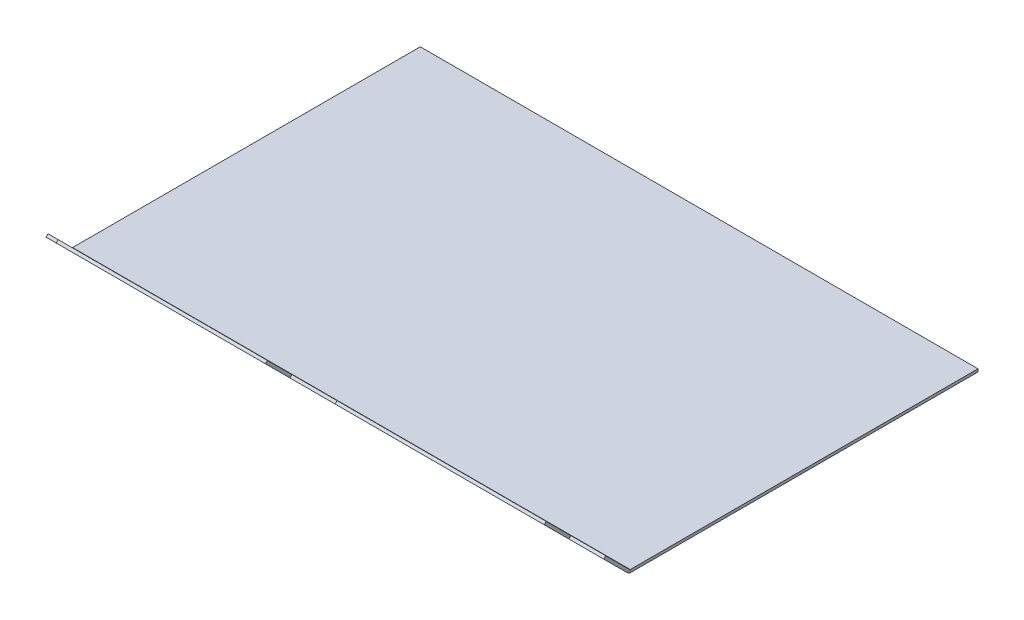
ISO-10303-21;
HEADER;
FILE_DESCRIPTION(('STEP AP214'),'2;1');
FILE_NAME('part.step','',(''),(''),'','','');
FILE_SCHEMA(('AUTOMOTIVE_DESIGN { 1 0 10303 214 1 1 1 1 }'));
ENDSEC;
DATA;
#1=APPLICATION_CONTEXT('core data for automotive mechanical design processes');
#2=APPLICATION_PROTOCOL_DEFINITION('international standard','automotive_design',2000,#1);
#3=PRODUCT_CONTEXT('',#1,'mechanical');
#4=PRODUCT('Part','Part','',(#3));
#5=PRODUCT_RELATED_PRODUCT_CATEGORY('part','',(#4));
#6=PRODUCT_DEFINITION_FORMATION('','',#4);
#7=PRODUCT_DEFINITION_CONTEXT('part definition',#1,'design');
#8=PRODUCT_DEFINITION('design','',#6,#7);
#9=PRODUCT_DEFINITION_SHAPE('','',#8);
#10=(LENGTH_UNIT() NAMED_UNIT(*) SI_UNIT(.MILLI.,.METRE.));
#11=(NAMED_UNIT(*) PLANE_ANGLE_UNIT() SI_UNIT($,.RADIAN.));
#12=(NAMED_UNIT(*) SI_UNIT($,.STERADIAN.) SOLID_ANGLE_UNIT());
#13=UNCERTAINTY_MEASURE_WITH_UNIT(LENGTH_MEASURE(1.E-05),#10,'distance_accuracy_value','');
#14=(GEOMETRIC_REPRESENTATION_CONTEXT(3) GLOBAL_UNCERTAINTY_ASSIGNED_CONTEXT((#13)) GLOBAL_UNIT_ASSIGNED_CONTEXT((#10,
#11,#12)) REPRESENTATION_CONTEXT('',''));
#15=CARTESIAN_POINT('',(0.,0.,0.));
#16=DIRECTION('',(0.,0.,1.));
#17=DIRECTION('',(1.,0.,0.));
#18=AXIS2_PLACEMENT_3D('',#15,#16,#17);
#19=CARTESIAN_POINT('',(-200.,33.674651235032,-13.8737731554559));
#20=DIRECTION('',(0.,0.707106781186549,0.707106781186546));
#21=DIRECTION('',(1.,0.,0.));
#22=AXIS2_PLACEMENT_3D('',#19,#20,#21);
#23=PLANE('',#22);
#24=DIRECTION('',(0.,0.707106781186546,-0.707106781186549));
#25=VECTOR('',#24,1.);
#26=CARTESIAN_POINT('',(-175.,33.674651235032,-13.873773155456));
#27=LINE('',#26,#25);
#28=CARTESIAN_POINT('',(-175.,33.674651235032,-13.873773155456));
#29=VERTEX_POINT('',#28);
#30=CARTESIAN_POINT('',(-175.,35.0888647974051,-15.287986717829));
#31=VERTEX_POINT('',#30);
#32=EDGE_CURVE('E163',#29,#31,#27,.T.);
#33=ORIENTED_EDGE('',*,*,#32,.F.);
#34=DIRECTION('',(1.,0.,0.));
#35=VECTOR('',#34,1.);
#36=CARTESIAN_POINT('',(-200.,33.674651235032,-13.8737731554559));
#37=LINE('',#36,#35);
#38=CARTESIAN_POINT('',(-25.,33.674651235032,-13.873773155456));
#39=VERTEX_POINT('',#38);
#40=EDGE_CURVE('E177',#29,#39,#37,.T.);
#41=ORIENTED_EDGE('',*,*,#40,.T.);
#42=DIRECTION('',(0.,0.707106781186546,-0.707106781186549));
#43=VECTOR('',#42,1.);
#44=CARTESIAN_POINT('',(-25.,33.674651235032,-13.873773155456));
#45=LINE('',#44,#43);
#46=CARTESIAN_POINT('',(-25.,35.0888647974051,-15.2879867178291));
#47=VERTEX_POINT('',#46);
#48=EDGE_CURVE('E257',#39,#47,#45,.T.);
#49=ORIENTED_EDGE('',*,*,#48,.T.);
#50=DIRECTION('',(1.,0.,0.));
#51=VECTOR('',#50,1.);
#52=CARTESIAN_POINT('',(-200.,35.0888647974051,-15.287986717829));
#53=LINE('',#52,#51);
#54=EDGE_CURVE('E179',#31,#47,#53,.T.);
#55=ORIENTED_EDGE('',*,*,#54,.F.);
#56=EDGE_LOOP('',(#33,#41,#49,#55));
#57=FACE_BOUND('',#56,.T.);
#58=ADVANCED_FACE('F43',(#57),#23,.T.);
#59=CARTESIAN_POINT('',(200.,33.674651235032,-13.8737731554559));
#60=DIRECTION('',(1.,0.,0.));
#61=DIRECTION('',(0.,-0.707106781186549,-0.707106781186546));
#62=AXIS2_PLACEMENT_3D('',#59,#60,#61);
#63=PLANE('',#62);
#64=DIRECTION('',(0.,0.707106781186546,-0.707106781186549));
#65=VECTOR('',#64,1.);
#66=CARTESIAN_POINT('',(200.,15.9969817053683,-31.5514426851196));
#67=LINE('',#66,#65);
#68=CARTESIAN_POINT('',(200.,15.9969817053683,-31.5514426851196));
#69=VERTEX_POINT('',#68);
#70=CARTESIAN_POINT('',(200.,17.4111952677414,-32.9656562474927));
#71=VERTEX_POINT('',#70);
#72=EDGE_CURVE('E60',#69,#71,#67,.T.);
#73=ORIENTED_EDGE('',*,*,#72,.F.);
#74=DIRECTION('',(0.,-0.707106781186549,-0.707106781186546));
#75=VECTOR('',#74,1.);
#76=CARTESIAN_POINT('',(200.,33.674651235032,-13.8737731554559));
#77=LINE('',#76,#75);
#78=CARTESIAN_POINT('',(200.,-1.19846841739511,-48.7468928078829));
#79=VERTEX_POINT('',#78);
#80=EDGE_CURVE('E206',#69,#79,#77,.T.);
#81=ORIENTED_EDGE('',*,*,#80,.T.);
#82=DIRECTION('',(0.,0.707106781186546,-0.707106781186549));
#83=VECTOR('',#82,1.);
#84=CARTESIAN_POINT('',(200.,-1.19846841739511,-48.7468928078829));
#85=LINE('',#84,#83);
#86=CARTESIAN_POINT('',(200.,0.21574514497799,-50.161106370256));
#87=VERTEX_POINT('',#86);
#88=EDGE_CURVE('E12',#79,#87,#85,.T.);
#89=ORIENTED_EDGE('',*,*,#88,.T.);
#90=DIRECTION('',(0.,-0.707106781186549,-0.707106781186546));
#91=VECTOR('',#90,1.);
#92=CARTESIAN_POINT('',(200.,35.0888647974051,-15.287986717829));
#93=LINE('',#92,#91);
#94=EDGE_CURVE('E208',#71,#87,#93,.T.);
#95=ORIENTED_EDGE('',*,*,#94,.F.);
#96=EDGE_LOOP('',(#73,#81,#89,#95));
#97=FACE_BOUND('',#96,.T.);
#98=ADVANCED_FACE('F45',(#97),#63,.T.);
#99=CARTESIAN_POINT('',(-200.,33.674651235032,-13.8737731554559));
#100=DIRECTION('',(-1.,0.,0.));
#101=DIRECTION('',(0.,0.707106781186549,0.707106781186546));
#102=AXIS2_PLACEMENT_3D('',#99,#100,#101);
#103=PLANE('',#102);
#104=DIRECTION('',(0.,0.707106781186546,-0.707106781186549));
#105=VECTOR('',#104,1.);
#106=CARTESIAN_POINT('',(-200.,15.9969817053683,-31.5514426851196));
#107=LINE('',#106,#105);
#108=CARTESIAN_POINT('',(-200.,15.9969817053683,-31.5514426851196));
#109=VERTEX_POINT('',#108);
#110=CARTESIAN_POINT('',(-200.,17.4111952677414,-32.9656562474927));
#111=VERTEX_POINT('',#110);
#112=EDGE_CURVE('E220',#109,#111,#107,.T.);
#113=ORIENTED_EDGE('',*,*,#112,.T.);
#114=DIRECTION('',(0.,0.707106781186549,0.707106781186546));
#115=VECTOR('',#114,1.);
#116=CARTESIAN_POINT('',(-200.,35.0888647974051,-15.287986717829));
#117=LINE('',#116,#115);
#118=CARTESIAN_POINT('',(-200.,0.21574514497799,-50.161106370256));
#119=VERTEX_POINT('',#118);
#120=EDGE_CURVE('E200',#119,#111,#117,.T.);
#121=ORIENTED_EDGE('',*,*,#120,.F.);
#122=DIRECTION('',(0.,-0.707106781186546,0.707106781186549));
#123=VECTOR('',#122,1.);
#124=CARTESIAN_POINT('',(-200.,-1.19846841739511,-48.7468928078829));
#125=LINE('',#124,#123);
#126=CARTESIAN_POINT('',(-200.,-1.1984684173951,-48.7468928078829));
#127=VERTEX_POINT('',#126);
#128=EDGE_CURVE('E191',#119,#127,#125,.T.);
#129=ORIENTED_EDGE('',*,*,#128,.T.);
#130=DIRECTION('',(0.,0.707106781186549,0.707106781186546));
#131=VECTOR('',#130,1.);
#132=CARTESIAN_POINT('',(-200.,33.674651235032,-13.8737731554559));
#133=LINE('',#132,#131);
#134=EDGE_CURVE('E47',#127,#109,#133,.T.);
#135=ORIENTED_EDGE('',*,*,#134,.T.);
#136=EDGE_LOOP('',(#113,#121,#129,#135));
#137=FACE_BOUND('',#136,.T.);
#138=ADVANCED_FACE('F218',(#137),#103,.T.);
#139=CARTESIAN_POINT('',(0.,33.674651235032,-13.8737731554559));
#140=DIRECTION('',(0.,-0.707106781186546,0.707106781186549));
#141=DIRECTION('',(0.,-0.707106781186549,-0.707106781186546));
#142=AXIS2_PLACEMENT_3D('',#139,#140,#141);
#143=PLANE('',#142);
#144=DIRECTION('',(0.,0.707106781186549,0.707106781186546));
#145=VECTOR('',#144,1.);
#146=CARTESIAN_POINT('',(175.,15.9969817053683,-31.5514426851196));
#147=LINE('',#146,#145);
#148=CARTESIAN_POINT('',(175.,15.9969817053683,-31.5514426851196));
#149=VERTEX_POINT('',#148);
#150=CARTESIAN_POINT('',(175.,33.6746512350319,-13.873773155456));
#151=VERTEX_POINT('',#150);
#152=EDGE_CURVE('E234',#149,#151,#147,.T.);
#153=ORIENTED_EDGE('',*,*,#152,.T.);
#154=CARTESIAN_POINT('',(25.,33.674651235032,-13.873773155456));
#155=VERTEX_POINT('',#154);
#156=EDGE_CURVE('E188',#155,#151,#37,.T.);
#157=ORIENTED_EDGE('',*,*,#156,.F.);
#158=DIRECTION('',(0.,-0.707106781186549,-0.707106781186546));
#159=VECTOR('',#158,1.);
#160=CARTESIAN_POINT('',(25.,33.674651235032,-13.873773155456));
#161=LINE('',#160,#159);
#162=CARTESIAN_POINT('',(25.,15.9969817053682,-31.5514426851196));
#163=VERTEX_POINT('',#162);
#164=EDGE_CURVE('E247',#155,#163,#161,.T.);
#165=ORIENTED_EDGE('',*,*,#164,.T.);
#166=DIRECTION('',(-1.,0.,0.));
#167=VECTOR('',#166,1.);
#168=CARTESIAN_POINT('',(-25.,15.9969817053682,-31.5514426851196));
#169=LINE('',#168,#167);
#170=CARTESIAN_POINT('',(-25.,15.9969817053682,-31.5514426851196));
#171=VERTEX_POINT('',#170);
#172=EDGE_CURVE('E250',#163,#171,#169,.T.);
#173=ORIENTED_EDGE('',*,*,#172,.T.);
#174=DIRECTION('',(0.,0.707106781186549,0.707106781186546));
#175=VECTOR('',#174,1.);
#176=CARTESIAN_POINT('',(-25.,33.674651235032,-13.873773155456));
#177=LINE('',#176,#175);
#178=EDGE_CURVE('E186',#171,#39,#177,.T.);
#179=ORIENTED_EDGE('',*,*,#178,.T.);
#180=ORIENTED_EDGE('',*,*,#40,.F.);
#181=DIRECTION('',(0.,-0.707106781186549,-0.707106781186546));
#182=VECTOR('',#181,1.);
#183=CARTESIAN_POINT('',(-175.,15.9969817053683,-31.5514426851196));
#184=LINE('',#183,#182);
#185=CARTESIAN_POINT('',(-175.,15.9969817053683,-31.5514426851196));
#186=VERTEX_POINT('',#185);
#187=EDGE_CURVE('E159',#29,#186,#184,.T.);
#188=ORIENTED_EDGE('',*,*,#187,.T.);
#189=DIRECTION('',(-1.,0.,0.));
#190=VECTOR('',#189,1.);
#191=CARTESIAN_POINT('',(-200.,15.9969817053683,-31.5514426851196));
#192=LINE('',#191,#190);
#193=EDGE_CURVE('E170',#186,#109,#192,.T.);
#194=ORIENTED_EDGE('',*,*,#193,.T.);
#195=ORIENTED_EDGE('',*,*,#134,.F.);
#196=DIRECTION('',(1.,0.,0.));
#197=VECTOR('',#196,1.);
#198=CARTESIAN_POINT('',(0.,-1.19846841739511,-48.7468928078829));
#199=LINE('',#198,#197);
#200=EDGE_CURVE('E187',#127,#79,#199,.T.);
#201=ORIENTED_EDGE('',*,*,#200,.T.);
#202=ORIENTED_EDGE('',*,*,#80,.F.);
#203=DIRECTION('',(-1.,0.,0.));
#204=VECTOR('',#203,1.);
#205=CARTESIAN_POINT('',(200.,15.9969817053683,-31.5514426851196));
#206=LINE('',#205,#204);
#207=EDGE_CURVE('E231',#69,#149,#206,.T.);
#208=ORIENTED_EDGE('',*,*,#207,.T.);
#209=EDGE_LOOP('',(#153,#157,#165,#173,#179,#180,#188,#194,#195,#201,#202,#208));
#210=FACE_BOUND('',#209,.T.);
#211=ADVANCED_FACE('F183',(#210),#143,.T.);
#212=DIRECTION('',(0.,0.707106781186546,-0.707106781186549));
#213=VECTOR('',#212,1.);
#214=CARTESIAN_POINT('',(175.,33.6746512350319,-13.873773155456));
#215=LINE('',#214,#213);
#216=CARTESIAN_POINT('',(175.,35.088864797405,-15.2879867178291));
#217=VERTEX_POINT('',#216);
#218=EDGE_CURVE('E240',#151,#217,#215,.T.);
#219=ORIENTED_EDGE('',*,*,#218,.T.);
#220=CARTESIAN_POINT('',(25.,35.0888647974051,-15.287986717829));
#221=VERTEX_POINT('',#220);
#222=EDGE_CURVE('E198',#221,#217,#53,.T.);
#223=ORIENTED_EDGE('',*,*,#222,.F.);
#224=DIRECTION('',(0.,0.707106781186546,-0.707106781186549));
#225=VECTOR('',#224,1.);
#226=CARTESIAN_POINT('',(25.,33.674651235032,-13.873773155456));
#227=LINE('',#226,#225);
#228=EDGE_CURVE('E68',#155,#221,#227,.T.);
#229=ORIENTED_EDGE('',*,*,#228,.F.);
#230=ORIENTED_EDGE('',*,*,#156,.T.);
#231=EDGE_LOOP('',(#219,#223,#229,#230));
#232=FACE_BOUND('',#231,.T.);
#233=ADVANCED_FACE('F347',(#232),#23,.T.);
#234=CARTESIAN_POINT('',(0.,35.0888647974051,-15.287986717829));
#235=DIRECTION('',(0.,-0.707106781186546,0.707106781186549));
#236=DIRECTION('',(0.,-0.707106781186549,-0.707106781186546));
#237=AXIS2_PLACEMENT_3D('',#234,#235,#236);
#238=PLANE('',#237);
#239=ORIENTED_EDGE('',*,*,#222,.T.);
#240=DIRECTION('',(0.,0.707106781186549,0.707106781186546));
#241=VECTOR('',#240,1.);
#242=CARTESIAN_POINT('',(175.,17.4111952677414,-32.9656562474927));
#243=LINE('',#242,#241);
#244=CARTESIAN_POINT('',(175.,17.4111952677414,-32.9656562474927));
#245=VERTEX_POINT('',#244);
#246=EDGE_CURVE('E235',#245,#217,#243,.T.);
#247=ORIENTED_EDGE('',*,*,#246,.F.);
#248=DIRECTION('',(-1.,0.,0.));
#249=VECTOR('',#248,1.);
#250=CARTESIAN_POINT('',(200.,17.4111952677414,-32.9656562474927));
#251=LINE('',#250,#249);
#252=EDGE_CURVE('E237',#71,#245,#251,.T.);
#253=ORIENTED_EDGE('',*,*,#252,.F.);
#254=ORIENTED_EDGE('',*,*,#94,.T.);
#255=DIRECTION('',(1.,0.,0.));
#256=VECTOR('',#255,1.);
#257=CARTESIAN_POINT('',(0.,0.215745144977984,-50.161106370256));
#258=LINE('',#257,#256);
#259=EDGE_CURVE('E52',#119,#87,#258,.T.);
#260=ORIENTED_EDGE('',*,*,#259,.F.);
#261=ORIENTED_EDGE('',*,*,#120,.T.);
#262=DIRECTION('',(-1.,0.,0.));
#263=VECTOR('',#262,1.);
#264=CARTESIAN_POINT('',(-200.,17.4111952677414,-32.9656562474927));
#265=LINE('',#264,#263);
#266=CARTESIAN_POINT('',(-175.,17.4111952677414,-32.9656562474927));
#267=VERTEX_POINT('',#266);
#268=EDGE_CURVE('E171',#267,#111,#265,.T.);
#269=ORIENTED_EDGE('',*,*,#268,.F.);
#270=DIRECTION('',(0.,-0.707106781186549,-0.707106781186546));
#271=VECTOR('',#270,1.);
#272=CARTESIAN_POINT('',(-175.,17.4111952677414,-32.9656562474927));
#273=LINE('',#272,#271);
#274=EDGE_CURVE('E243',#31,#267,#273,.T.);
#275=ORIENTED_EDGE('',*,*,#274,.F.);
#276=ORIENTED_EDGE('',*,*,#54,.T.);
#277=DIRECTION('',(0.,0.707106781186549,0.707106781186546));
#278=VECTOR('',#277,1.);
#279=CARTESIAN_POINT('',(-25.,35.0888647974051,-15.2879867178291));
#280=LINE('',#279,#278);
#281=CARTESIAN_POINT('',(-25.,17.4111952677413,-32.9656562474927));
#282=VERTEX_POINT('',#281);
#283=EDGE_CURVE('E251',#282,#47,#280,.T.);
#284=ORIENTED_EDGE('',*,*,#283,.F.);
#285=DIRECTION('',(-1.,0.,0.));
#286=VECTOR('',#285,1.);
#287=CARTESIAN_POINT('',(-25.,17.4111952677413,-32.9656562474927));
#288=LINE('',#287,#286);
#289=CARTESIAN_POINT('',(25.,17.4111952677413,-32.9656562474927));
#290=VERTEX_POINT('',#289);
#291=EDGE_CURVE('E225',#290,#282,#288,.T.);
#292=ORIENTED_EDGE('',*,*,#291,.F.);
#293=DIRECTION('',(0.,-0.707106781186549,-0.707106781186546));
#294=VECTOR('',#293,1.);
#295=CARTESIAN_POINT('',(25.,35.0888647974051,-15.2879867178291));
#296=LINE('',#295,#294);
#297=EDGE_CURVE('E223',#221,#290,#296,.T.);
#298=ORIENTED_EDGE('',*,*,#297,.F.);
#299=EDGE_LOOP('',(#239,#247,#253,#254,#260,#261,#269,#275,#276,#284,#292,#298));
#300=FACE_BOUND('',#299,.T.);
#301=ADVANCED_FACE('F215',(#300),#238,.F.);
#302=CARTESIAN_POINT('',(-200.,-2.,-300.));
#303=DIRECTION('',(0.,0.,-1.));
#304=DIRECTION('',(-1.,0.,0.));
#305=AXIS2_PLACEMENT_3D('',#302,#303,#304);
#306=PLANE('',#305);
#307=DIRECTION('',(-1.,0.,0.));
#308=VECTOR('',#307,1.);
#309=CARTESIAN_POINT('',(-200.,0.,-300.));
#310=LINE('',#309,#308);
#311=CARTESIAN_POINT('',(200.,0.,-300.));
#312=VERTEX_POINT('',#311);
#313=CARTESIAN_POINT('',(-200.,0.,-300.));
#314=VERTEX_POINT('',#313);
#315=EDGE_CURVE('E280',#312,#314,#310,.T.);
#316=ORIENTED_EDGE('',*,*,#315,.F.);
#317=DIRECTION('',(0.,1.,0.));
#318=VECTOR('',#317,1.);
#319=CARTESIAN_POINT('',(200.,-2.,-300.));
#320=LINE('',#319,#318);
#321=CARTESIAN_POINT('',(200.,-2.,-300.));
#322=VERTEX_POINT('',#321);
#323=EDGE_CURVE('E209',#322,#312,#320,.T.);
#324=ORIENTED_EDGE('',*,*,#323,.F.);
#325=DIRECTION('',(-1.,0.,0.));
#326=VECTOR('',#325,1.);
#327=CARTESIAN_POINT('',(-200.,-2.,-300.));
#328=LINE('',#327,#326);
#329=CARTESIAN_POINT('',(-200.,-2.,-300.));
#330=VERTEX_POINT('',#329);
#331=EDGE_CURVE('E294',#322,#330,#328,.T.);
#332=ORIENTED_EDGE('',*,*,#331,.T.);
#333=DIRECTION('',(0.,1.,0.));
#334=VECTOR('',#333,1.);
#335=CARTESIAN_POINT('',(-200.,-2.,-300.));
#336=LINE('',#335,#334);
#337=EDGE_CURVE('E292',#330,#314,#336,.T.);
#338=ORIENTED_EDGE('',*,*,#337,.T.);
#339=EDGE_LOOP('',(#316,#324,#332,#338));
#340=FACE_BOUND('',#339,.T.);
#341=ADVANCED_FACE('F332',(#340),#306,.T.);
#342=CARTESIAN_POINT('',(0.,-2.,0.));
#343=DIRECTION('',(0.,-1.,0.));
#344=DIRECTION('',(0.,0.,-1.));
#345=AXIS2_PLACEMENT_3D('',#342,#343,#344);
#346=PLANE('',#345);
#347=DIRECTION('',(1.,0.,0.));
#348=VECTOR('',#347,1.);
#349=CARTESIAN_POINT('',(0.,-2.,-50.681961225278));
#350=LINE('',#349,#348);
#351=CARTESIAN_POINT('',(-200.,-2.,-50.681961225278));
#352=VERTEX_POINT('',#351);
#353=CARTESIAN_POINT('',(200.,-2.,-50.681961225278));
#354=VERTEX_POINT('',#353);
#355=EDGE_CURVE('E196',#352,#354,#350,.T.);
#356=ORIENTED_EDGE('',*,*,#355,.F.);
#357=DIRECTION('',(0.,0.,1.));
#358=VECTOR('',#357,1.);
#359=CARTESIAN_POINT('',(-200.,-2.,0.));
#360=LINE('',#359,#358);
#361=EDGE_CURVE('E290',#330,#352,#360,.T.);
#362=ORIENTED_EDGE('',*,*,#361,.F.);
#363=ORIENTED_EDGE('',*,*,#331,.F.);
#364=DIRECTION('',(0.,0.,-1.));
#365=VECTOR('',#364,1.);
#366=CARTESIAN_POINT('',(200.,-2.,0.));
#367=LINE('',#366,#365);
#368=EDGE_CURVE('E278',#354,#322,#367,.T.);
#369=ORIENTED_EDGE('',*,*,#368,.F.);
#370=EDGE_LOOP('',(#356,#362,#363,#369));
#371=FACE_BOUND('',#370,.T.);
#372=ADVANCED_FACE('F334',(#371),#346,.T.);
#373=CARTESIAN_POINT('',(-200.,-2.,0.));
#374=DIRECTION('',(-1.,0.,0.));
#375=DIRECTION('',(0.,0.,1.));
#376=AXIS2_PLACEMENT_3D('',#373,#374,#375);
#377=PLANE('',#376);
#378=DIRECTION('',(0.,-1.,0.));
#379=VECTOR('',#378,1.);
#380=CARTESIAN_POINT('',(-200.,-2.,-50.681961225278));
#381=LINE('',#380,#379);
#382=CARTESIAN_POINT('',(-200.,0.,-50.681961225278));
#383=VERTEX_POINT('',#382);
#384=EDGE_CURVE('E297',#383,#352,#381,.T.);
#385=ORIENTED_EDGE('',*,*,#384,.F.);
#386=DIRECTION('',(0.,0.,1.));
#387=VECTOR('',#386,1.);
#388=CARTESIAN_POINT('',(-200.,0.,0.));
#389=LINE('',#388,#387);
#390=EDGE_CURVE('E288',#314,#383,#389,.T.);
#391=ORIENTED_EDGE('',*,*,#390,.F.);
#392=ORIENTED_EDGE('',*,*,#337,.F.);
#393=ORIENTED_EDGE('',*,*,#361,.T.);
#394=EDGE_LOOP('',(#385,#391,#392,#393));
#395=FACE_BOUND('',#394,.T.);
#396=ADVANCED_FACE('F324',(#395),#377,.T.);
#397=CARTESIAN_POINT('',(0.,0.,0.));
#398=DIRECTION('',(0.,-1.,0.));
#399=DIRECTION('',(0.,0.,-1.));
#400=AXIS2_PLACEMENT_3D('',#397,#398,#399);
#401=PLANE('',#400);
#402=ORIENTED_EDGE('',*,*,#390,.T.);
#403=DIRECTION('',(1.,0.,0.));
#404=VECTOR('',#403,1.);
#405=CARTESIAN_POINT('',(0.,0.,-50.681961225278));
#406=LINE('',#405,#404);
#407=CARTESIAN_POINT('',(200.,0.,-50.681961225278));
#408=VERTEX_POINT('',#407);
#409=EDGE_CURVE('E285',#383,#408,#406,.T.);
#410=ORIENTED_EDGE('',*,*,#409,.T.);
#411=DIRECTION('',(0.,0.,-1.));
#412=VECTOR('',#411,1.);
#413=CARTESIAN_POINT('',(200.,0.,0.));
#414=LINE('',#413,#412);
#415=EDGE_CURVE('E283',#408,#312,#414,.T.);
#416=ORIENTED_EDGE('',*,*,#415,.T.);
#417=ORIENTED_EDGE('',*,*,#315,.T.);
#418=EDGE_LOOP('',(#402,#410,#416,#417));
#419=FACE_BOUND('',#418,.T.);
#420=ADVANCED_FACE('F328',(#419),#401,.F.);
#421=CARTESIAN_POINT('',(200.,-2.,0.));
#422=DIRECTION('',(1.,0.,0.));
#423=DIRECTION('',(0.,0.,-1.));
#424=AXIS2_PLACEMENT_3D('',#421,#422,#423);
#425=PLANE('',#424);
#426=DIRECTION('',(0.,1.,0.));
#427=VECTOR('',#426,1.);
#428=CARTESIAN_POINT('',(200.,-2.,-50.681961225278));
#429=LINE('',#428,#427);
#430=EDGE_CURVE('E299',#354,#408,#429,.T.);
#431=ORIENTED_EDGE('',*,*,#430,.F.);
#432=ORIENTED_EDGE('',*,*,#368,.T.);
#433=ORIENTED_EDGE('',*,*,#323,.T.);
#434=ORIENTED_EDGE('',*,*,#415,.F.);
#435=EDGE_LOOP('',(#431,#432,#433,#434));
#436=FACE_BOUND('',#435,.T.);
#437=ADVANCED_FACE('F336',(#436),#425,.T.);
#438=CARTESIAN_POINT('',(-200.,0.7366,-50.681961225278));
#439=DIRECTION('',(-1.,0.,0.));
#440=DIRECTION('',(0.,0.,1.));
#441=AXIS2_PLACEMENT_3D('',#438,#439,#440);
#442=PLANE('',#441);
#443=ORIENTED_EDGE('',*,*,#128,.F.);
#444=CARTESIAN_POINT('',(-200.,0.7366,-50.681961225278));
#445=DIRECTION('',(-1.,0.,0.));
#446=DIRECTION('',(0.,0.,1.));
#447=AXIS2_PLACEMENT_3D('',#444,#445,#446);
#448=CIRCLE('',#447,0.7366);
#449=EDGE_CURVE('E259',#119,#383,#448,.F.);
#450=ORIENTED_EDGE('',*,*,#449,.T.);
#451=ORIENTED_EDGE('',*,*,#384,.T.);
#452=CARTESIAN_POINT('',(-200.,0.7366,-50.681961225278));
#453=DIRECTION('',(1.,0.,0.));
#454=DIRECTION('',(0.,0.,1.));
#455=AXIS2_PLACEMENT_3D('',#452,#453,#454);
#456=CIRCLE('',#455,2.7366);
#457=EDGE_CURVE('E265',#127,#352,#456,.T.);
#458=ORIENTED_EDGE('',*,*,#457,.F.);
#459=EDGE_LOOP('',(#443,#450,#451,#458));
#460=FACE_BOUND('',#459,.T.);
#461=ADVANCED_FACE('F318',(#460),#442,.T.);
#462=CARTESIAN_POINT('',(200.,0.7366,-50.681961225278));
#463=DIRECTION('',(1.,0.,0.));
#464=DIRECTION('',(0.,0.,-1.));
#465=AXIS2_PLACEMENT_3D('',#462,#463,#464);
#466=PLANE('',#465);
#467=CARTESIAN_POINT('',(200.,0.7366,-50.681961225278));
#468=DIRECTION('',(-1.,0.,0.));
#469=DIRECTION('',(0.,0.,1.));
#470=AXIS2_PLACEMENT_3D('',#467,#468,#469);
#471=CIRCLE('',#470,0.7366);
#472=EDGE_CURVE('E269',#408,#87,#471,.T.);
#473=ORIENTED_EDGE('',*,*,#472,.T.);
#474=ORIENTED_EDGE('',*,*,#88,.F.);
#475=CARTESIAN_POINT('',(200.,0.7366,-50.681961225278));
#476=DIRECTION('',(-1.,0.,0.));
#477=DIRECTION('',(0.,0.,-1.));
#478=AXIS2_PLACEMENT_3D('',#475,#476,#477);
#479=CIRCLE('',#478,2.7366);
#480=EDGE_CURVE('E268',#354,#79,#479,.T.);
#481=ORIENTED_EDGE('',*,*,#480,.F.);
#482=ORIENTED_EDGE('',*,*,#430,.T.);
#483=EDGE_LOOP('',(#473,#474,#481,#482));
#484=FACE_BOUND('',#483,.T.);
#485=ADVANCED_FACE('F313',(#484),#466,.T.);
#486=CARTESIAN_POINT('',(400.007325288489,0.7366,-50.681961225278));
#487=DIRECTION('',(-1.,0.,0.));
#488=DIRECTION('',(0.,0.,1.));
#489=AXIS2_PLACEMENT_3D('',#486,#487,#488);
#490=CYLINDRICAL_SURFACE('',#489,2.7366);
#491=ORIENTED_EDGE('',*,*,#355,.T.);
#492=ORIENTED_EDGE('',*,*,#480,.T.);
#493=ORIENTED_EDGE('',*,*,#200,.F.);
#494=ORIENTED_EDGE('',*,*,#457,.T.);
#495=EDGE_LOOP('',(#491,#492,#493,#494));
#496=FACE_BOUND('',#495,.T.);
#497=ADVANCED_FACE('F308',(#496),#490,.T.);
#498=CARTESIAN_POINT('',(400.007325288489,0.7366,-50.681961225278));
#499=DIRECTION('',(-1.,0.,0.));
#500=DIRECTION('',(0.,0.,1.));
#501=AXIS2_PLACEMENT_3D('',#498,#499,#500);
#502=CYLINDRICAL_SURFACE('',#501,0.7366);
#503=ORIENTED_EDGE('',*,*,#409,.F.);
#504=ORIENTED_EDGE('',*,*,#449,.F.);
#505=ORIENTED_EDGE('',*,*,#259,.T.);
#506=ORIENTED_EDGE('',*,*,#472,.F.);
#507=EDGE_LOOP('',(#503,#504,#505,#506));
#508=FACE_BOUND('',#507,.T.);
#509=ADVANCED_FACE('F326',(#508),#502,.F.);
#510=CARTESIAN_POINT('',(-25.,33.674651235032,-13.873773155456));
#511=DIRECTION('',(-1.,0.,0.));
#512=DIRECTION('',(0.,-1.,0.));
#513=AXIS2_PLACEMENT_3D('',#510,#511,#512);
#514=PLANE('',#513);
#515=ORIENTED_EDGE('',*,*,#283,.T.);
#516=ORIENTED_EDGE('',*,*,#48,.F.);
#517=ORIENTED_EDGE('',*,*,#178,.F.);
#518=DIRECTION('',(0.,0.707106781186546,-0.707106781186549));
#519=VECTOR('',#518,1.);
#520=CARTESIAN_POINT('',(-25.,15.9969817053682,-31.5514426851196));
#521=LINE('',#520,#519);
#522=EDGE_CURVE('E260',#171,#282,#521,.T.);
#523=ORIENTED_EDGE('',*,*,#522,.T.);
#524=EDGE_LOOP('',(#515,#516,#517,#523));
#525=FACE_BOUND('',#524,.T.);
#526=ADVANCED_FACE('F379',(#525),#514,.F.);
#527=CARTESIAN_POINT('',(-25.,15.9969817053682,-31.5514426851196));
#528=DIRECTION('',(0.,-0.707106781186549,-0.707106781186546));
#529=DIRECTION('',(0.,0.707106781186546,-0.707106781186549));
#530=AXIS2_PLACEMENT_3D('',#527,#528,#529);
#531=PLANE('',#530);
#532=ORIENTED_EDGE('',*,*,#291,.T.);
#533=ORIENTED_EDGE('',*,*,#522,.F.);
#534=ORIENTED_EDGE('',*,*,#172,.F.);
#535=DIRECTION('',(0.,0.707106781186546,-0.707106781186549));
#536=VECTOR('',#535,1.);
#537=CARTESIAN_POINT('',(25.,15.9969817053682,-31.5514426851196));
#538=LINE('',#537,#536);
#539=EDGE_CURVE('E262',#163,#290,#538,.T.);
#540=ORIENTED_EDGE('',*,*,#539,.T.);
#541=EDGE_LOOP('',(#532,#533,#534,#540));
#542=FACE_BOUND('',#541,.T.);
#543=ADVANCED_FACE('F368',(#542),#531,.F.);
#544=CARTESIAN_POINT('',(25.,33.674651235032,-13.873773155456));
#545=DIRECTION('',(1.,0.,0.));
#546=DIRECTION('',(0.,1.,0.));
#547=AXIS2_PLACEMENT_3D('',#544,#545,#546);
#548=PLANE('',#547);
#549=ORIENTED_EDGE('',*,*,#297,.T.);
#550=ORIENTED_EDGE('',*,*,#539,.F.);
#551=ORIENTED_EDGE('',*,*,#164,.F.);
#552=ORIENTED_EDGE('',*,*,#228,.T.);
#553=EDGE_LOOP('',(#549,#550,#551,#552));
#554=FACE_BOUND('',#553,.T.);
#555=ADVANCED_FACE('F365',(#554),#548,.F.);
#556=CARTESIAN_POINT('',(-200.,15.9969817053683,-31.5514426851196));
#557=DIRECTION('',(0.,-0.707106781186549,-0.707106781186546));
#558=DIRECTION('',(0.,0.707106781186546,-0.707106781186549));
#559=AXIS2_PLACEMENT_3D('',#556,#557,#558);
#560=PLANE('',#559);
#561=ORIENTED_EDGE('',*,*,#268,.T.);
#562=ORIENTED_EDGE('',*,*,#112,.F.);
#563=ORIENTED_EDGE('',*,*,#193,.F.);
#564=DIRECTION('',(0.,0.707106781186546,-0.707106781186549));
#565=VECTOR('',#564,1.);
#566=CARTESIAN_POINT('',(-175.,15.9969817053683,-31.5514426851196));
#567=LINE('',#566,#565);
#568=EDGE_CURVE('E165',#186,#267,#567,.T.);
#569=ORIENTED_EDGE('',*,*,#568,.T.);
#570=EDGE_LOOP('',(#561,#562,#563,#569));
#571=FACE_BOUND('',#570,.T.);
#572=ADVANCED_FACE('F387',(#571),#560,.F.);
#573=CARTESIAN_POINT('',(-175.,15.9969817053683,-31.5514426851196));
#574=DIRECTION('',(1.,0.,0.));
#575=DIRECTION('',(0.,0.,-1.));
#576=AXIS2_PLACEMENT_3D('',#573,#574,#575);
#577=PLANE('',#576);
#578=ORIENTED_EDGE('',*,*,#274,.T.);
#579=ORIENTED_EDGE('',*,*,#568,.F.);
#580=ORIENTED_EDGE('',*,*,#187,.F.);
#581=ORIENTED_EDGE('',*,*,#32,.T.);
#582=EDGE_LOOP('',(#578,#579,#580,#581));
#583=FACE_BOUND('',#582,.T.);
#584=ADVANCED_FACE('F162',(#583),#577,.F.);
#585=CARTESIAN_POINT('',(175.,15.9969817053683,-31.5514426851196));
#586=DIRECTION('',(-1.,0.,0.));
#587=DIRECTION('',(0.,0.,1.));
#588=AXIS2_PLACEMENT_3D('',#585,#586,#587);
#589=PLANE('',#588);
#590=ORIENTED_EDGE('',*,*,#246,.T.);
#591=ORIENTED_EDGE('',*,*,#218,.F.);
#592=ORIENTED_EDGE('',*,*,#152,.F.);
#593=DIRECTION('',(0.,0.707106781186546,-0.707106781186549));
#594=VECTOR('',#593,1.);
#595=CARTESIAN_POINT('',(175.,15.9969817053683,-31.5514426851196));
#596=LINE('',#595,#594);
#597=EDGE_CURVE('E244',#149,#245,#596,.T.);
#598=ORIENTED_EDGE('',*,*,#597,.T.);
#599=EDGE_LOOP('',(#590,#591,#592,#598));
#600=FACE_BOUND('',#599,.T.);
#601=ADVANCED_FACE('F369',(#600),#589,.F.);
#602=CARTESIAN_POINT('',(200.,15.9969817053683,-31.5514426851196));
#603=DIRECTION('',(0.,-0.707106781186549,-0.707106781186546));
#604=DIRECTION('',(0.,0.707106781186546,-0.707106781186549));
#605=AXIS2_PLACEMENT_3D('',#602,#603,#604);
#606=PLANE('',#605);
#607=ORIENTED_EDGE('',*,*,#252,.T.);
#608=ORIENTED_EDGE('',*,*,#597,.F.);
#609=ORIENTED_EDGE('',*,*,#207,.F.);
#610=ORIENTED_EDGE('',*,*,#72,.T.);
#611=EDGE_LOOP('',(#607,#608,#609,#610));
#612=FACE_BOUND('',#611,.T.);
#613=ADVANCED_FACE('F370',(#612),#606,.F.);
#614=CLOSED_SHELL('',(#58,#98,#138,#211,#233,#301,#341,#372,#396,#420,#437,#461,#485,#497,#509,
#526,#543,#555,#572,#584,#601,#613));
#615=MANIFOLD_SOLID_BREP('B2',#614);
#616=ADVANCED_BREP_SHAPE_REPRESENTATION('',(#18,#615),#14);
#617=SHAPE_DEFINITION_REPRESENTATION(#9,#616);
ENDSEC;
END-ISO-10303-21;
